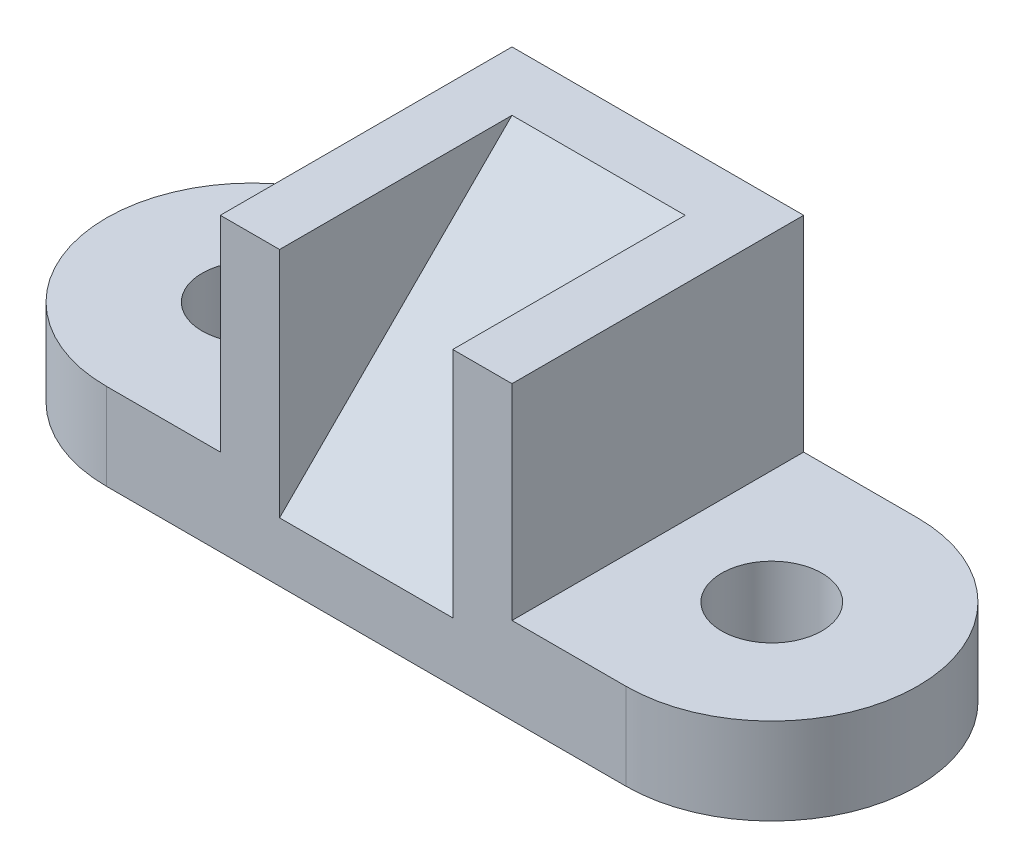
ISO-10303-21;
HEADER;
FILE_DESCRIPTION(('STEP AP214'),'2;1');
FILE_NAME('part.step','',(''),(''),'','','');
FILE_SCHEMA(('AUTOMOTIVE_DESIGN { 1 0 10303 214 1 1 1 1 }'));
ENDSEC;
DATA;
#1=APPLICATION_CONTEXT('core data for automotive mechanical design processes');
#2=APPLICATION_PROTOCOL_DEFINITION('international standard','automotive_design',2000,#1);
#3=PRODUCT_CONTEXT('',#1,'mechanical');
#4=PRODUCT('Part','Part','',(#3));
#5=PRODUCT_RELATED_PRODUCT_CATEGORY('part','',(#4));
#6=PRODUCT_DEFINITION_FORMATION('','',#4);
#7=PRODUCT_DEFINITION_CONTEXT('part definition',#1,'design');
#8=PRODUCT_DEFINITION('design','',#6,#7);
#9=PRODUCT_DEFINITION_SHAPE('','',#8);
#10=(LENGTH_UNIT() NAMED_UNIT(*) SI_UNIT(.MILLI.,.METRE.));
#11=(NAMED_UNIT(*) PLANE_ANGLE_UNIT() SI_UNIT($,.RADIAN.));
#12=(NAMED_UNIT(*) SI_UNIT($,.STERADIAN.) SOLID_ANGLE_UNIT());
#13=UNCERTAINTY_MEASURE_WITH_UNIT(LENGTH_MEASURE(1.E-05),#10,'distance_accuracy_value','');
#14=(GEOMETRIC_REPRESENTATION_CONTEXT(3) GLOBAL_UNCERTAINTY_ASSIGNED_CONTEXT((#13)) GLOBAL_UNIT_ASSIGNED_CONTEXT((#10,
#11,#12)) REPRESENTATION_CONTEXT('',''));
#15=CARTESIAN_POINT('',(0.,0.,0.));
#16=DIRECTION('',(0.,0.,1.));
#17=DIRECTION('',(1.,0.,0.));
#18=AXIS2_PLACEMENT_3D('',#15,#16,#17);
#19=CARTESIAN_POINT('',(-19.,64.000012,32.));
#20=DIRECTION('',(1.,0.,0.));
#21=DIRECTION('',(0.,0.,-1.));
#22=AXIS2_PLACEMENT_3D('',#19,#20,#21);
#23=PLANE('',#22);
#24=DIRECTION('',(0.,-1.,0.));
#25=VECTOR('',#24,1.);
#26=CARTESIAN_POINT('',(-19.,64.000012,32.));
#27=LINE('',#26,#25);
#28=CARTESIAN_POINT('',(-19.,64.,32.));
#29=VERTEX_POINT('',#28);
#30=CARTESIAN_POINT('',(-19.,13.,32.));
#31=VERTEX_POINT('',#30);
#32=EDGE_CURVE('E138',#29,#31,#27,.T.);
#33=ORIENTED_EDGE('',*,*,#32,.T.);
#34=DIRECTION('',(0.,-0.707106781186547,0.707106781186548));
#35=VECTOR('',#34,1.);
#36=CARTESIAN_POINT('',(-19.,64.,-19.));
#37=LINE('',#36,#35);
#38=CARTESIAN_POINT('',(-19.,64.,-19.));
#39=VERTEX_POINT('',#38);
#40=EDGE_CURVE('E146',#39,#31,#37,.T.);
#41=ORIENTED_EDGE('',*,*,#40,.F.);
#42=DIRECTION('',(0.,0.,-1.));
#43=VECTOR('',#42,1.);
#44=CARTESIAN_POINT('',(-19.,64.,0.));
#45=LINE('',#44,#43);
#46=EDGE_CURVE('E11',#29,#39,#45,.T.);
#47=ORIENTED_EDGE('',*,*,#46,.F.);
#48=EDGE_LOOP('',(#33,#41,#47));
#49=FACE_BOUND('',#48,.T.);
#50=ADVANCED_FACE('F45',(#49),#23,.T.);
#51=CARTESIAN_POINT('',(19.,64.000012,32.));
#52=DIRECTION('',(-1.,0.,0.));
#53=DIRECTION('',(0.,0.,1.));
#54=AXIS2_PLACEMENT_3D('',#51,#52,#53);
#55=PLANE('',#54);
#56=DIRECTION('',(0.,0.,1.));
#57=VECTOR('',#56,1.);
#58=CARTESIAN_POINT('',(19.,64.,0.));
#59=LINE('',#58,#57);
#60=CARTESIAN_POINT('',(19.,64.,-19.));
#61=VERTEX_POINT('',#60);
#62=CARTESIAN_POINT('',(19.,64.,32.));
#63=VERTEX_POINT('',#62);
#64=EDGE_CURVE('E54',#61,#63,#59,.T.);
#65=ORIENTED_EDGE('',*,*,#64,.F.);
#66=DIRECTION('',(0.,0.707106781186547,-0.707106781186548));
#67=VECTOR('',#66,1.);
#68=CARTESIAN_POINT('',(19.,64.,-19.));
#69=LINE('',#68,#67);
#70=CARTESIAN_POINT('',(19.,13.,32.));
#71=VERTEX_POINT('',#70);
#72=EDGE_CURVE('E141',#71,#61,#69,.T.);
#73=ORIENTED_EDGE('',*,*,#72,.F.);
#74=DIRECTION('',(0.,-1.,0.));
#75=VECTOR('',#74,1.);
#76=CARTESIAN_POINT('',(19.,64.000012,32.));
#77=LINE('',#76,#75);
#78=EDGE_CURVE('E129',#63,#71,#77,.T.);
#79=ORIENTED_EDGE('',*,*,#78,.F.);
#80=EDGE_LOOP('',(#65,#73,#79));
#81=FACE_BOUND('',#80,.T.);
#82=ADVANCED_FACE('F142',(#81),#55,.T.);
#83=CARTESIAN_POINT('',(-57.,19.,32.));
#84=DIRECTION('',(0.,0.,-1.));
#85=DIRECTION('',(-1.,0.,0.));
#86=AXIS2_PLACEMENT_3D('',#83,#84,#85);
#87=PLANE('',#86);
#88=ORIENTED_EDGE('',*,*,#32,.F.);
#89=DIRECTION('',(1.,0.,0.));
#90=VECTOR('',#89,1.);
#91=CARTESIAN_POINT('',(32.,64.,32.));
#92=LINE('',#91,#90);
#93=CARTESIAN_POINT('',(-32.,64.,32.));
#94=VERTEX_POINT('',#93);
#95=EDGE_CURVE('E161',#94,#29,#92,.T.);
#96=ORIENTED_EDGE('',*,*,#95,.F.);
#97=DIRECTION('',(0.,-1.,0.));
#98=VECTOR('',#97,1.);
#99=CARTESIAN_POINT('',(-32.,64.,32.));
#100=LINE('',#99,#98);
#101=CARTESIAN_POINT('',(-32.,19.,32.));
#102=VERTEX_POINT('',#101);
#103=EDGE_CURVE('E188',#94,#102,#100,.T.);
#104=ORIENTED_EDGE('',*,*,#103,.T.);
#105=DIRECTION('',(1.,0.,0.));
#106=VECTOR('',#105,1.);
#107=CARTESIAN_POINT('',(-57.,19.,32.));
#108=LINE('',#107,#106);
#109=CARTESIAN_POINT('',(-57.,19.,32.));
#110=VERTEX_POINT('',#109);
#111=EDGE_CURVE('E215',#110,#102,#108,.T.);
#112=ORIENTED_EDGE('',*,*,#111,.F.);
#113=DIRECTION('',(0.,-1.,0.));
#114=VECTOR('',#113,1.);
#115=CARTESIAN_POINT('',(-57.,19.,32.));
#116=LINE('',#115,#114);
#117=CARTESIAN_POINT('',(-57.,0.,32.));
#118=VERTEX_POINT('',#117);
#119=EDGE_CURVE('E248',#110,#118,#116,.T.);
#120=ORIENTED_EDGE('',*,*,#119,.T.);
#121=DIRECTION('',(1.,0.,0.));
#122=VECTOR('',#121,1.);
#123=CARTESIAN_POINT('',(-57.,0.,32.));
#124=LINE('',#123,#122);
#125=CARTESIAN_POINT('',(57.,0.,32.));
#126=VERTEX_POINT('',#125);
#127=EDGE_CURVE('E229',#118,#126,#124,.T.);
#128=ORIENTED_EDGE('',*,*,#127,.T.);
#129=DIRECTION('',(0.,-1.,0.));
#130=VECTOR('',#129,1.);
#131=CARTESIAN_POINT('',(57.,19.,32.));
#132=LINE('',#131,#130);
#133=CARTESIAN_POINT('',(57.,19.,32.));
#134=VERTEX_POINT('',#133);
#135=EDGE_CURVE('E244',#134,#126,#132,.T.);
#136=ORIENTED_EDGE('',*,*,#135,.F.);
#137=CARTESIAN_POINT('',(32.,19.,32.));
#138=VERTEX_POINT('',#137);
#139=EDGE_CURVE('E213',#138,#134,#108,.T.);
#140=ORIENTED_EDGE('',*,*,#139,.F.);
#141=DIRECTION('',(0.,-1.,0.));
#142=VECTOR('',#141,1.);
#143=CARTESIAN_POINT('',(32.,64.,32.));
#144=LINE('',#143,#142);
#145=CARTESIAN_POINT('',(32.,64.,32.));
#146=VERTEX_POINT('',#145);
#147=EDGE_CURVE('E184',#146,#138,#144,.T.);
#148=ORIENTED_EDGE('',*,*,#147,.F.);
#149=EDGE_CURVE('E136',#63,#146,#92,.T.);
#150=ORIENTED_EDGE('',*,*,#149,.F.);
#151=ORIENTED_EDGE('',*,*,#78,.T.);
#152=DIRECTION('',(1.,0.,0.));
#153=VECTOR('',#152,1.);
#154=CARTESIAN_POINT('',(19.,13.,32.));
#155=LINE('',#154,#153);
#156=EDGE_CURVE('E133',#31,#71,#155,.T.);
#157=ORIENTED_EDGE('',*,*,#156,.F.);
#158=EDGE_LOOP('',(#88,#96,#104,#112,#120,#128,#136,#140,#148,#150,#151,#157));
#159=FACE_BOUND('',#158,.T.);
#160=ADVANCED_FACE('F131',(#159),#87,.F.);
#161=CARTESIAN_POINT('',(0.,64.,0.));
#162=DIRECTION('',(0.,1.,0.));
#163=DIRECTION('',(0.,0.,1.));
#164=AXIS2_PLACEMENT_3D('',#161,#162,#163);
#165=PLANE('',#164);
#166=ORIENTED_EDGE('',*,*,#95,.T.);
#167=ORIENTED_EDGE('',*,*,#46,.T.);
#168=DIRECTION('',(1.,0.,0.));
#169=VECTOR('',#168,1.);
#170=CARTESIAN_POINT('',(0.,64.,-19.));
#171=LINE('',#170,#169);
#172=EDGE_CURVE('E252',#39,#61,#171,.T.);
#173=ORIENTED_EDGE('',*,*,#172,.T.);
#174=ORIENTED_EDGE('',*,*,#64,.T.);
#175=ORIENTED_EDGE('',*,*,#149,.T.);
#176=DIRECTION('',(0.,0.,-1.));
#177=VECTOR('',#176,1.);
#178=CARTESIAN_POINT('',(32.,64.,32.));
#179=LINE('',#178,#177);
#180=CARTESIAN_POINT('',(32.,64.,-32.));
#181=VERTEX_POINT('',#180);
#182=EDGE_CURVE('E165',#146,#181,#179,.T.);
#183=ORIENTED_EDGE('',*,*,#182,.T.);
#184=DIRECTION('',(-1.,0.,0.));
#185=VECTOR('',#184,1.);
#186=CARTESIAN_POINT('',(32.,64.,-32.));
#187=LINE('',#186,#185);
#188=CARTESIAN_POINT('',(-32.,64.,-32.));
#189=VERTEX_POINT('',#188);
#190=EDGE_CURVE('E168',#181,#189,#187,.T.);
#191=ORIENTED_EDGE('',*,*,#190,.T.);
#192=DIRECTION('',(0.,0.,1.));
#193=VECTOR('',#192,1.);
#194=CARTESIAN_POINT('',(-32.,64.,32.));
#195=LINE('',#194,#193);
#196=EDGE_CURVE('E156',#189,#94,#195,.T.);
#197=ORIENTED_EDGE('',*,*,#196,.T.);
#198=EDGE_LOOP('',(#166,#167,#173,#174,#175,#183,#191,#197));
#199=FACE_BOUND('',#198,.T.);
#200=ADVANCED_FACE('F256',(#199),#165,.T.);
#201=CARTESIAN_POINT('',(-57.,19.,0.));
#202=DIRECTION('',(0.,1.,0.));
#203=DIRECTION('',(0.,0.,1.));
#204=AXIS2_PLACEMENT_3D('',#201,#202,#203);
#205=PLANE('',#204);
#206=DIRECTION('',(0.,0.,1.));
#207=VECTOR('',#206,1.);
#208=CARTESIAN_POINT('',(-32.,19.,32.));
#209=LINE('',#208,#207);
#210=CARTESIAN_POINT('',(-32.,19.,-32.));
#211=VERTEX_POINT('',#210);
#212=EDGE_CURVE('E68',#211,#102,#209,.T.);
#213=ORIENTED_EDGE('',*,*,#212,.F.);
#214=DIRECTION('',(-1.,0.,0.));
#215=VECTOR('',#214,1.);
#216=CARTESIAN_POINT('',(-57.,19.,-32.));
#217=LINE('',#216,#215);
#218=CARTESIAN_POINT('',(-57.,19.,-32.));
#219=VERTEX_POINT('',#218);
#220=EDGE_CURVE('E221',#211,#219,#217,.T.);
#221=ORIENTED_EDGE('',*,*,#220,.T.);
#222=CARTESIAN_POINT('',(-57.,19.,0.));
#223=DIRECTION('',(0.,1.,0.));
#224=DIRECTION('',(0.,0.,1.));
#225=AXIS2_PLACEMENT_3D('',#222,#223,#224);
#226=CIRCLE('',#225,32.);
#227=EDGE_CURVE('E209',#219,#110,#226,.T.);
#228=ORIENTED_EDGE('',*,*,#227,.T.);
#229=ORIENTED_EDGE('',*,*,#111,.T.);
#230=EDGE_LOOP('',(#213,#221,#228,#229));
#231=FACE_BOUND('',#230,.T.);
#232=CARTESIAN_POINT('',(-57.,19.,0.));
#233=DIRECTION('',(0.,1.,0.));
#234=DIRECTION('',(0.,0.,1.));
#235=AXIS2_PLACEMENT_3D('',#232,#233,#234);
#236=CIRCLE('',#235,11.);
#237=CARTESIAN_POINT('',(-57.,19.,11.));
#238=VERTEX_POINT('',#237);
#239=EDGE_CURVE('E201',#238,#238,#236,.T.);
#240=ORIENTED_EDGE('',*,*,#239,.F.);
#241=EDGE_LOOP('',(#240));
#242=FACE_BOUND('',#241,.T.);
#243=ADVANCED_FACE('F304',(#231,#242),#205,.T.);
#244=DIRECTION('',(0.,0.,-1.));
#245=VECTOR('',#244,1.);
#246=CARTESIAN_POINT('',(32.,19.,32.));
#247=LINE('',#246,#245);
#248=CARTESIAN_POINT('',(32.,19.,-32.));
#249=VERTEX_POINT('',#248);
#250=EDGE_CURVE('E160',#138,#249,#247,.T.);
#251=ORIENTED_EDGE('',*,*,#250,.F.);
#252=ORIENTED_EDGE('',*,*,#139,.T.);
#253=CARTESIAN_POINT('',(57.,19.,0.));
#254=DIRECTION('',(0.,1.,0.));
#255=DIRECTION('',(0.,0.,1.));
#256=AXIS2_PLACEMENT_3D('',#253,#254,#255);
#257=CIRCLE('',#256,32.);
#258=CARTESIAN_POINT('',(57.,19.,-32.));
#259=VERTEX_POINT('',#258);
#260=EDGE_CURVE('E218',#134,#259,#257,.T.);
#261=ORIENTED_EDGE('',*,*,#260,.T.);
#262=EDGE_CURVE('E222',#259,#249,#217,.T.);
#263=ORIENTED_EDGE('',*,*,#262,.T.);
#264=EDGE_LOOP('',(#251,#252,#261,#263));
#265=FACE_BOUND('',#264,.T.);
#266=CARTESIAN_POINT('',(57.,19.,0.));
#267=DIRECTION('',(0.,1.,0.));
#268=DIRECTION('',(0.,0.,1.));
#269=AXIS2_PLACEMENT_3D('',#266,#267,#268);
#270=CIRCLE('',#269,11.);
#271=CARTESIAN_POINT('',(57.,19.,11.));
#272=VERTEX_POINT('',#271);
#273=EDGE_CURVE('E193',#272,#272,#270,.T.);
#274=ORIENTED_EDGE('',*,*,#273,.F.);
#275=EDGE_LOOP('',(#274));
#276=FACE_BOUND('',#275,.T.);
#277=ADVANCED_FACE('F274',(#265,#276),#205,.T.);
#278=CARTESIAN_POINT('',(-57.,0.,0.));
#279=DIRECTION('',(0.,1.,0.));
#280=DIRECTION('',(0.,0.,1.));
#281=AXIS2_PLACEMENT_3D('',#278,#279,#280);
#282=PLANE('',#281);
#283=CARTESIAN_POINT('',(-57.,0.,0.));
#284=DIRECTION('',(0.,1.,0.));
#285=DIRECTION('',(0.,0.,1.));
#286=AXIS2_PLACEMENT_3D('',#283,#284,#285);
#287=CIRCLE('',#286,32.);
#288=CARTESIAN_POINT('',(-57.,0.,-32.));
#289=VERTEX_POINT('',#288);
#290=EDGE_CURVE('E205',#289,#118,#287,.T.);
#291=ORIENTED_EDGE('',*,*,#290,.F.);
#292=DIRECTION('',(-1.,0.,0.));
#293=VECTOR('',#292,1.);
#294=CARTESIAN_POINT('',(-57.,0.,-32.));
#295=LINE('',#294,#293);
#296=CARTESIAN_POINT('',(57.,0.,-32.));
#297=VERTEX_POINT('',#296);
#298=EDGE_CURVE('E214',#297,#289,#295,.T.);
#299=ORIENTED_EDGE('',*,*,#298,.F.);
#300=CARTESIAN_POINT('',(57.,0.,0.));
#301=DIRECTION('',(0.,1.,0.));
#302=DIRECTION('',(0.,0.,1.));
#303=AXIS2_PLACEMENT_3D('',#300,#301,#302);
#304=CIRCLE('',#303,32.);
#305=EDGE_CURVE('E232',#126,#297,#304,.T.);
#306=ORIENTED_EDGE('',*,*,#305,.F.);
#307=ORIENTED_EDGE('',*,*,#127,.F.);
#308=EDGE_LOOP('',(#291,#299,#306,#307));
#309=FACE_BOUND('',#308,.T.);
#310=CARTESIAN_POINT('',(-57.,0.,0.));
#311=DIRECTION('',(0.,1.,0.));
#312=DIRECTION('',(0.,0.,1.));
#313=AXIS2_PLACEMENT_3D('',#310,#311,#312);
#314=CIRCLE('',#313,11.);
#315=CARTESIAN_POINT('',(-57.,0.,11.));
#316=VERTEX_POINT('',#315);
#317=EDGE_CURVE('E197',#316,#316,#314,.T.);
#318=ORIENTED_EDGE('',*,*,#317,.T.);
#319=EDGE_LOOP('',(#318));
#320=FACE_BOUND('',#319,.T.);
#321=CARTESIAN_POINT('',(57.,0.,0.));
#322=DIRECTION('',(0.,1.,0.));
#323=DIRECTION('',(0.,0.,1.));
#324=AXIS2_PLACEMENT_3D('',#321,#322,#323);
#325=CIRCLE('',#324,11.);
#326=CARTESIAN_POINT('',(57.,0.,11.));
#327=VERTEX_POINT('',#326);
#328=EDGE_CURVE('E192',#327,#327,#325,.T.);
#329=ORIENTED_EDGE('',*,*,#328,.T.);
#330=EDGE_LOOP('',(#329));
#331=FACE_BOUND('',#330,.T.);
#332=ADVANCED_FACE('F318',(#309,#320,#331),#282,.F.);
#333=CARTESIAN_POINT('',(-57.,19.,0.));
#334=DIRECTION('',(0.,-1.,0.));
#335=DIRECTION('',(0.,0.,-1.));
#336=AXIS2_PLACEMENT_3D('',#333,#334,#335);
#337=CYLINDRICAL_SURFACE('',#336,32.);
#338=ORIENTED_EDGE('',*,*,#290,.T.);
#339=ORIENTED_EDGE('',*,*,#119,.F.);
#340=ORIENTED_EDGE('',*,*,#227,.F.);
#341=DIRECTION('',(0.,-1.,0.));
#342=VECTOR('',#341,1.);
#343=CARTESIAN_POINT('',(-57.,19.,-32.));
#344=LINE('',#343,#342);
#345=EDGE_CURVE('E225',#219,#289,#344,.T.);
#346=ORIENTED_EDGE('',*,*,#345,.T.);
#347=EDGE_LOOP('',(#338,#339,#340,#346));
#348=FACE_BOUND('',#347,.T.);
#349=ADVANCED_FACE('F47',(#348),#337,.T.);
#350=CARTESIAN_POINT('',(57.,19.,0.));
#351=DIRECTION('',(0.,-1.,0.));
#352=DIRECTION('',(0.,0.,-1.));
#353=AXIS2_PLACEMENT_3D('',#350,#351,#352);
#354=CYLINDRICAL_SURFACE('',#353,32.);
#355=ORIENTED_EDGE('',*,*,#305,.T.);
#356=DIRECTION('',(0.,-1.,0.));
#357=VECTOR('',#356,1.);
#358=CARTESIAN_POINT('',(57.,19.,-32.));
#359=LINE('',#358,#357);
#360=EDGE_CURVE('E240',#259,#297,#359,.T.);
#361=ORIENTED_EDGE('',*,*,#360,.F.);
#362=ORIENTED_EDGE('',*,*,#260,.F.);
#363=ORIENTED_EDGE('',*,*,#135,.T.);
#364=EDGE_LOOP('',(#355,#361,#362,#363));
#365=FACE_BOUND('',#364,.T.);
#366=ADVANCED_FACE('F280',(#365),#354,.T.);
#367=CARTESIAN_POINT('',(-57.,19.,-32.));
#368=DIRECTION('',(0.,0.,1.));
#369=DIRECTION('',(1.,0.,0.));
#370=AXIS2_PLACEMENT_3D('',#367,#368,#369);
#371=PLANE('',#370);
#372=ORIENTED_EDGE('',*,*,#298,.T.);
#373=ORIENTED_EDGE('',*,*,#345,.F.);
#374=ORIENTED_EDGE('',*,*,#220,.F.);
#375=DIRECTION('',(0.,-1.,0.));
#376=VECTOR('',#375,1.);
#377=CARTESIAN_POINT('',(-32.,64.,-32.));
#378=LINE('',#377,#376);
#379=EDGE_CURVE('E171',#189,#211,#378,.T.);
#380=ORIENTED_EDGE('',*,*,#379,.F.);
#381=ORIENTED_EDGE('',*,*,#190,.F.);
#382=DIRECTION('',(0.,-1.,0.));
#383=VECTOR('',#382,1.);
#384=CARTESIAN_POINT('',(32.,64.,-32.));
#385=LINE('',#384,#383);
#386=EDGE_CURVE('E180',#181,#249,#385,.T.);
#387=ORIENTED_EDGE('',*,*,#386,.T.);
#388=ORIENTED_EDGE('',*,*,#262,.F.);
#389=ORIENTED_EDGE('',*,*,#360,.T.);
#390=EDGE_LOOP('',(#372,#373,#374,#380,#381,#387,#388,#389));
#391=FACE_BOUND('',#390,.T.);
#392=ADVANCED_FACE('F265',(#391),#371,.F.);
#393=CARTESIAN_POINT('',(-57.,19.,0.));
#394=DIRECTION('',(0.,-1.,0.));
#395=DIRECTION('',(0.,0.,-1.));
#396=AXIS2_PLACEMENT_3D('',#393,#394,#395);
#397=CYLINDRICAL_SURFACE('',#396,11.);
#398=ORIENTED_EDGE('',*,*,#239,.T.);
#399=EDGE_LOOP('',(#398));
#400=FACE_BOUND('',#399,.T.);
#401=ORIENTED_EDGE('',*,*,#317,.F.);
#402=EDGE_LOOP('',(#401));
#403=FACE_BOUND('',#402,.T.);
#404=ADVANCED_FACE('F317',(#400,#403),#397,.F.);
#405=CARTESIAN_POINT('',(57.,19.,0.));
#406=DIRECTION('',(0.,-1.,0.));
#407=DIRECTION('',(0.,0.,-1.));
#408=AXIS2_PLACEMENT_3D('',#405,#406,#407);
#409=CYLINDRICAL_SURFACE('',#408,11.);
#410=ORIENTED_EDGE('',*,*,#273,.T.);
#411=EDGE_LOOP('',(#410));
#412=FACE_BOUND('',#411,.T.);
#413=ORIENTED_EDGE('',*,*,#328,.F.);
#414=EDGE_LOOP('',(#413));
#415=FACE_BOUND('',#414,.T.);
#416=ADVANCED_FACE('F295',(#412,#415),#409,.F.);
#417=CARTESIAN_POINT('',(-32.,64.,32.));
#418=DIRECTION('',(1.,0.,0.));
#419=DIRECTION('',(0.,0.,-1.));
#420=AXIS2_PLACEMENT_3D('',#417,#418,#419);
#421=PLANE('',#420);
#422=ORIENTED_EDGE('',*,*,#212,.T.);
#423=ORIENTED_EDGE('',*,*,#103,.F.);
#424=ORIENTED_EDGE('',*,*,#196,.F.);
#425=ORIENTED_EDGE('',*,*,#379,.T.);
#426=EDGE_LOOP('',(#422,#423,#424,#425));
#427=FACE_BOUND('',#426,.T.);
#428=ADVANCED_FACE('F263',(#427),#421,.F.);
#429=CARTESIAN_POINT('',(32.,64.,32.));
#430=DIRECTION('',(-1.,0.,0.));
#431=DIRECTION('',(0.,0.,1.));
#432=AXIS2_PLACEMENT_3D('',#429,#430,#431);
#433=PLANE('',#432);
#434=ORIENTED_EDGE('',*,*,#250,.T.);
#435=ORIENTED_EDGE('',*,*,#386,.F.);
#436=ORIENTED_EDGE('',*,*,#182,.F.);
#437=ORIENTED_EDGE('',*,*,#147,.T.);
#438=EDGE_LOOP('',(#434,#435,#436,#437));
#439=FACE_BOUND('',#438,.T.);
#440=ADVANCED_FACE('F285',(#439),#433,.F.);
#441=CARTESIAN_POINT('',(-89.002,64.,-19.));
#442=DIRECTION('',(0.,-0.707106781186548,-0.707106781186547));
#443=DIRECTION('',(0.,0.707106781186547,-0.707106781186548));
#444=AXIS2_PLACEMENT_3D('',#441,#442,#443);
#445=PLANE('',#444);
#446=ORIENTED_EDGE('',*,*,#172,.F.);
#447=ORIENTED_EDGE('',*,*,#40,.T.);
#448=ORIENTED_EDGE('',*,*,#156,.T.);
#449=ORIENTED_EDGE('',*,*,#72,.T.);
#450=EDGE_LOOP('',(#446,#447,#448,#449));
#451=FACE_BOUND('',#450,.T.);
#452=ADVANCED_FACE('F148',(#451),#445,.F.);
#453=CLOSED_SHELL('',(#50,#82,#160,#200,#243,#277,#332,#349,#366,#392,#404,#416,#428,#440,#452));
#454=MANIFOLD_SOLID_BREP('B2',#453);
#455=ADVANCED_BREP_SHAPE_REPRESENTATION('',(#18,#454),#14);
#456=SHAPE_DEFINITION_REPRESENTATION(#9,#455);
ENDSEC;
END-ISO-10303-21;
